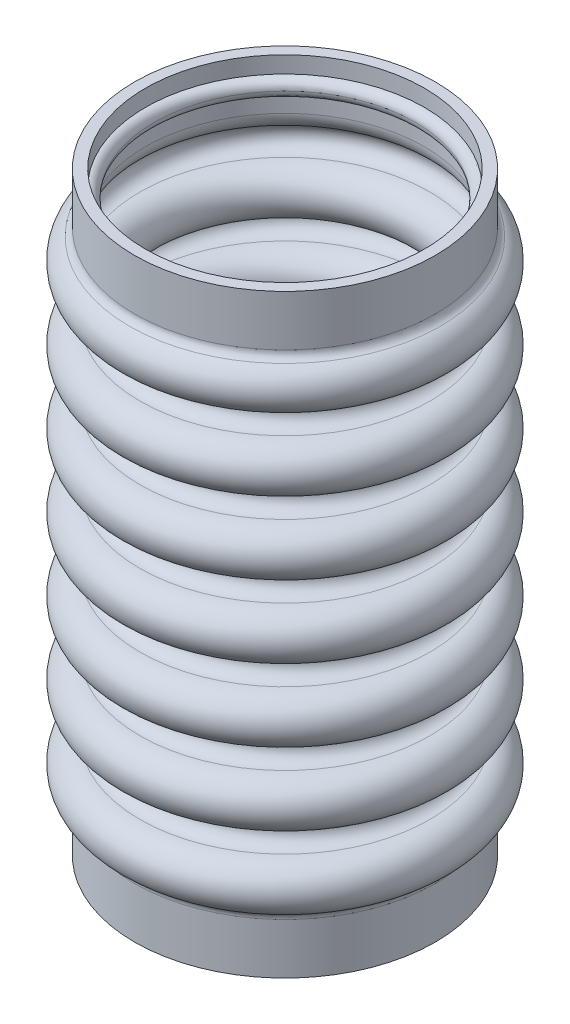
ISO-10303-21;
HEADER;
FILE_DESCRIPTION(('STEP AP214'),'2;1');
FILE_NAME('part.step','',(''),(''),'','','');
FILE_SCHEMA(('AUTOMOTIVE_DESIGN { 1 0 10303 214 1 1 1 1 }'));
ENDSEC;
DATA;
#1=APPLICATION_CONTEXT('core data for automotive mechanical design processes');
#2=APPLICATION_PROTOCOL_DEFINITION('international standard','automotive_design',2000,#1);
#3=PRODUCT_CONTEXT('',#1,'mechanical');
#4=PRODUCT('Part','Part','',(#3));
#5=PRODUCT_RELATED_PRODUCT_CATEGORY('part','',(#4));
#6=PRODUCT_DEFINITION_FORMATION('','',#4);
#7=PRODUCT_DEFINITION_CONTEXT('part definition',#1,'design');
#8=PRODUCT_DEFINITION('design','',#6,#7);
#9=PRODUCT_DEFINITION_SHAPE('','',#8);
#10=(LENGTH_UNIT() NAMED_UNIT(*) SI_UNIT(.MILLI.,.METRE.));
#11=(NAMED_UNIT(*) PLANE_ANGLE_UNIT() SI_UNIT($,.RADIAN.));
#12=(NAMED_UNIT(*) SI_UNIT($,.STERADIAN.) SOLID_ANGLE_UNIT());
#13=UNCERTAINTY_MEASURE_WITH_UNIT(LENGTH_MEASURE(1.E-05),#10,'distance_accuracy_value','');
#14=(GEOMETRIC_REPRESENTATION_CONTEXT(3) GLOBAL_UNCERTAINTY_ASSIGNED_CONTEXT((#13)) GLOBAL_UNIT_ASSIGNED_CONTEXT((#10,
#11,#12)) REPRESENTATION_CONTEXT('',''));
#15=CARTESIAN_POINT('',(0.,0.,0.));
#16=DIRECTION('',(0.,0.,1.));
#17=DIRECTION('',(1.,0.,0.));
#18=AXIS2_PLACEMENT_3D('',#15,#16,#17);
#19=CARTESIAN_POINT('',(0.,81.8309598041131,0.));
#20=DIRECTION('',(0.,1.,0.));
#21=DIRECTION('',(0.,0.,1.));
#22=AXIS2_PLACEMENT_3D('',#19,#20,#21);
#23=CYLINDRICAL_SURFACE('',#22,19.25);
#24=CARTESIAN_POINT('',(0.,8.46658803335676,0.));
#25=DIRECTION('',(0.,1.,0.));
#26=DIRECTION('',(0.,0.,1.));
#27=AXIS2_PLACEMENT_3D('',#24,#25,#26);
#28=CIRCLE('',#27,19.25);
#29=CARTESIAN_POINT('',(0.,8.46658803335676,19.25));
#30=VERTEX_POINT('',#29);
#31=EDGE_CURVE('E104',#30,#30,#28,.T.);
#32=ORIENTED_EDGE('',*,*,#31,.T.);
#33=EDGE_LOOP('',(#32));
#34=FACE_BOUND('',#33,.T.);
#35=CARTESIAN_POINT('',(0.,6.16658803335676,0.));
#36=DIRECTION('',(0.,1.,0.));
#37=DIRECTION('',(0.,0.,1.));
#38=AXIS2_PLACEMENT_3D('',#35,#36,#37);
#39=CIRCLE('',#38,19.25);
#40=CARTESIAN_POINT('',(0.,6.16658803335676,19.25));
#41=VERTEX_POINT('',#40);
#42=EDGE_CURVE('E52',#41,#41,#39,.T.);
#43=ORIENTED_EDGE('',*,*,#42,.F.);
#44=EDGE_LOOP('',(#43));
#45=FACE_BOUND('',#44,.T.);
#46=ADVANCED_FACE('F34',(#34,#45),#23,.F.);
#47=CARTESIAN_POINT('',(0.,81.8309598041131,0.));
#48=DIRECTION('',(0.,1.,0.));
#49=DIRECTION('',(0.,0.,1.));
#50=AXIS2_PLACEMENT_3D('',#47,#48,#49);
#51=CYLINDRICAL_SURFACE('',#50,19.25);
#52=CARTESIAN_POINT('',(0.,76.5348805808426,0.));
#53=DIRECTION('',(0.,1.,0.));
#54=DIRECTION('',(0.,0.,1.));
#55=AXIS2_PLACEMENT_3D('',#52,#53,#54);
#56=CIRCLE('',#55,19.25);
#57=CARTESIAN_POINT('',(0.,76.5348805808426,19.25));
#58=VERTEX_POINT('',#57);
#59=EDGE_CURVE('E59',#58,#58,#56,.T.);
#60=ORIENTED_EDGE('',*,*,#59,.F.);
#61=EDGE_LOOP('',(#60));
#62=FACE_BOUND('',#61,.T.);
#63=CARTESIAN_POINT('',(0.,78.8348805808426,0.));
#64=DIRECTION('',(0.,1.,0.));
#65=DIRECTION('',(0.,0.,1.));
#66=AXIS2_PLACEMENT_3D('',#63,#64,#65);
#67=CIRCLE('',#66,19.25);
#68=CARTESIAN_POINT('',(0.,78.8348805808426,19.25));
#69=VERTEX_POINT('',#68);
#70=EDGE_CURVE('E51',#69,#69,#67,.T.);
#71=ORIENTED_EDGE('',*,*,#70,.T.);
#72=EDGE_LOOP('',(#71));
#73=FACE_BOUND('',#72,.T.);
#74=ADVANCED_FACE('F181',(#62,#73),#51,.F.);
#75=CARTESIAN_POINT('',(0.,81.2348805808426,0.));
#76=DIRECTION('',(0.,1.,0.));
#77=DIRECTION('',(0.,0.,1.));
#78=AXIS2_PLACEMENT_3D('',#75,#76,#77);
#79=CIRCLE('',#78,19.25);
#80=CARTESIAN_POINT('',(0.,81.2348805808426,19.25));
#81=VERTEX_POINT('',#80);
#82=EDGE_CURVE('E42',#81,#81,#79,.T.);
#83=ORIENTED_EDGE('',*,*,#82,.F.);
#84=EDGE_LOOP('',(#83));
#85=FACE_BOUND('',#84,.T.);
#86=CARTESIAN_POINT('',(0.,83.5348805808426,0.));
#87=DIRECTION('',(0.,-1.,0.));
#88=DIRECTION('',(0.,0.,-1.));
#89=AXIS2_PLACEMENT_3D('',#86,#87,#88);
#90=CIRCLE('',#89,19.25);
#91=CARTESIAN_POINT('',(0.,83.5348805808426,-19.25));
#92=VERTEX_POINT('',#91);
#93=EDGE_CURVE('E158',#92,#92,#90,.T.);
#94=ORIENTED_EDGE('',*,*,#93,.F.);
#95=EDGE_LOOP('',(#94));
#96=FACE_BOUND('',#95,.T.);
#97=ADVANCED_FACE('F188',(#85,#96),#51,.F.);
#98=CARTESIAN_POINT('',(0.,76.5348805808426,0.));
#99=DIRECTION('',(0.,1.,0.));
#100=DIRECTION('',(0.,0.,1.));
#101=AXIS2_PLACEMENT_3D('',#98,#99,#100);
#102=TOROIDAL_SURFACE('',#101,22.,2.75);
#103=ORIENTED_EDGE('',*,*,#59,.T.);
#104=EDGE_LOOP('',(#103));
#105=FACE_BOUND('',#104,.T.);
#106=CARTESIAN_POINT('',(0.,74.0691268389424,0.));
#107=DIRECTION('',(0.,1.,0.));
#108=DIRECTION('',(0.,0.,1.));
#109=AXIS2_PLACEMENT_3D('',#106,#107,#108);
#110=CIRCLE('',#109,20.7823964174226);
#111=CARTESIAN_POINT('',(0.,74.0691268389424,20.7823964174226));
#112=VERTEX_POINT('',#111);
#113=EDGE_CURVE('E62',#112,#112,#110,.T.);
#114=ORIENTED_EDGE('',*,*,#113,.F.);
#115=EDGE_LOOP('',(#114));
#116=FACE_BOUND('',#115,.T.);
#117=ADVANCED_FACE('F326',(#105,#116),#102,.T.);
#118=CARTESIAN_POINT('',(0.,72.5000056653708,0.));
#119=DIRECTION('',(0.,1.,0.));
#120=DIRECTION('',(0.,0.,1.));
#121=AXIS2_PLACEMENT_3D('',#118,#119,#120);
#122=TOROIDAL_SURFACE('',#121,20.007555227902,1.75000575037007);
#123=ORIENTED_EDGE('',*,*,#113,.T.);
#124=EDGE_LOOP('',(#123));
#125=FACE_BOUND('',#124,.T.);
#126=CARTESIAN_POINT('',(0.,70.7500013204338,0.));
#127=DIRECTION('',(0.,1.,0.));
#128=DIRECTION('',(0.,0.,1.));
#129=AXIS2_PLACEMENT_3D('',#126,#127,#128);
#130=CIRCLE('',#129,20.0053373392861);
#131=CARTESIAN_POINT('',(0.,70.7500013204338,20.0053373392861));
#132=VERTEX_POINT('',#131);
#133=EDGE_CURVE('E65',#132,#132,#130,.T.);
#134=ORIENTED_EDGE('',*,*,#133,.F.);
#135=EDGE_LOOP('',(#134));
#136=FACE_BOUND('',#135,.T.);
#137=ADVANCED_FACE('F330',(#125,#136),#122,.F.);
#138=CARTESIAN_POINT('',(0.,67.5000039275327,0.));
#139=DIRECTION('',(0.,1.,0.));
#140=DIRECTION('',(0.,0.,1.));
#141=AXIS2_PLACEMENT_3D('',#138,#139,#140);
#142=TOROIDAL_SURFACE('',#141,20.0012184168156,3.25000000298248);
#143=ORIENTED_EDGE('',*,*,#133,.T.);
#144=EDGE_LOOP('',(#143));
#145=FACE_BOUND('',#144,.T.);
#146=CARTESIAN_POINT('',(0.,64.2500027376119,0.));
#147=DIRECTION('',(0.,1.,0.));
#148=DIRECTION('',(0.,0.,1.));
#149=AXIS2_PLACEMENT_3D('',#146,#147,#148);
#150=CIRCLE('',#149,20.0034163015585);
#151=CARTESIAN_POINT('',(0.,64.2500027376119,20.0034163015585));
#152=VERTEX_POINT('',#151);
#153=EDGE_CURVE('E68',#152,#152,#150,.T.);
#154=ORIENTED_EDGE('',*,*,#153,.F.);
#155=EDGE_LOOP('',(#154));
#156=FACE_BOUND('',#155,.T.);
#157=ADVANCED_FACE('F334',(#145,#156),#142,.T.);
#158=CARTESIAN_POINT('',(0.,62.5000008894755,0.));
#159=DIRECTION('',(0.,1.,0.));
#160=DIRECTION('',(0.,0.,1.));
#161=AXIS2_PLACEMENT_3D('',#158,#159,#160);
#162=TOROIDAL_SURFACE('',#161,20.004599778775,1.75000224831263);
#163=ORIENTED_EDGE('',*,*,#153,.T.);
#164=EDGE_LOOP('',(#163));
#165=FACE_BOUND('',#164,.T.);
#166=CARTESIAN_POINT('',(0.,60.750000711924,0.));
#167=DIRECTION('',(0.,1.,0.));
#168=DIRECTION('',(0.,0.,1.));
#169=AXIS2_PLACEMENT_3D('',#166,#167,#168);
#170=CIRCLE('',#169,20.0048940231412);
#171=CARTESIAN_POINT('',(0.,60.750000711924,20.0048940231412));
#172=VERTEX_POINT('',#171);
#173=EDGE_CURVE('E71',#172,#172,#170,.T.);
#174=ORIENTED_EDGE('',*,*,#173,.F.);
#175=EDGE_LOOP('',(#174));
#176=FACE_BOUND('',#175,.T.);
#177=ADVANCED_FACE('F338',(#165,#176),#162,.F.);
#178=CARTESIAN_POINT('',(0.,57.5000029033183,0.));
#179=DIRECTION('',(0.,1.,0.));
#180=DIRECTION('',(0.,0.,1.));
#181=AXIS2_PLACEMENT_3D('',#178,#179,#180);
#182=TOROIDAL_SURFACE('',#181,20.0012184168156,3.24999988708052);
#183=ORIENTED_EDGE('',*,*,#173,.T.);
#184=EDGE_LOOP('',(#183));
#185=FACE_BOUND('',#184,.T.);
#186=CARTESIAN_POINT('',(0.,54.2500017133975,0.));
#187=DIRECTION('',(0.,1.,0.));
#188=DIRECTION('',(0.,0.,1.));
#189=AXIS2_PLACEMENT_3D('',#186,#187,#188);
#190=CIRCLE('',#189,20.0034163015584);
#191=CARTESIAN_POINT('',(0.,54.2500017133975,20.0034163015584));
#192=VERTEX_POINT('',#191);
#193=EDGE_CURVE('E74',#192,#192,#190,.T.);
#194=ORIENTED_EDGE('',*,*,#193,.F.);
#195=EDGE_LOOP('',(#194));
#196=FACE_BOUND('',#195,.T.);
#197=ADVANCED_FACE('F342',(#185,#196),#182,.T.);
#198=CARTESIAN_POINT('',(0.,52.4999998652611,0.));
#199=DIRECTION('',(0.,1.,0.));
#200=DIRECTION('',(0.,0.,1.));
#201=AXIS2_PLACEMENT_3D('',#198,#199,#200);
#202=TOROIDAL_SURFACE('',#201,20.004599778775,1.75000224831263);
#203=ORIENTED_EDGE('',*,*,#193,.T.);
#204=EDGE_LOOP('',(#203));
#205=FACE_BOUND('',#204,.T.);
#206=CARTESIAN_POINT('',(0.,50.7499996877096,0.));
#207=DIRECTION('',(0.,1.,0.));
#208=DIRECTION('',(0.,0.,1.));
#209=AXIS2_PLACEMENT_3D('',#206,#207,#208);
#210=CIRCLE('',#209,20.0048940231412);
#211=CARTESIAN_POINT('',(0.,50.7499996877096,20.0048940231412));
#212=VERTEX_POINT('',#211);
#213=EDGE_CURVE('E77',#212,#212,#210,.T.);
#214=ORIENTED_EDGE('',*,*,#213,.F.);
#215=EDGE_LOOP('',(#214));
#216=FACE_BOUND('',#215,.T.);
#217=ADVANCED_FACE('F346',(#205,#216),#202,.F.);
#218=CARTESIAN_POINT('',(0.,47.5000018791039,0.));
#219=DIRECTION('',(0.,1.,0.));
#220=DIRECTION('',(0.,0.,1.));
#221=AXIS2_PLACEMENT_3D('',#218,#219,#220);
#222=TOROIDAL_SURFACE('',#221,20.0012184168156,3.24999988708052);
#223=ORIENTED_EDGE('',*,*,#213,.T.);
#224=EDGE_LOOP('',(#223));
#225=FACE_BOUND('',#224,.T.);
#226=CARTESIAN_POINT('',(0.,44.2500006891831,0.));
#227=DIRECTION('',(0.,1.,0.));
#228=DIRECTION('',(0.,0.,1.));
#229=AXIS2_PLACEMENT_3D('',#226,#227,#228);
#230=CIRCLE('',#229,20.0034163015584);
#231=CARTESIAN_POINT('',(0.,44.2500006891831,20.0034163015584));
#232=VERTEX_POINT('',#231);
#233=EDGE_CURVE('E80',#232,#232,#230,.T.);
#234=ORIENTED_EDGE('',*,*,#233,.F.);
#235=EDGE_LOOP('',(#234));
#236=FACE_BOUND('',#235,.T.);
#237=ADVANCED_FACE('F350',(#225,#236),#222,.T.);
#238=CARTESIAN_POINT('',(0.,42.4999988410467,0.));
#239=DIRECTION('',(0.,1.,0.));
#240=DIRECTION('',(0.,0.,1.));
#241=AXIS2_PLACEMENT_3D('',#238,#239,#240);
#242=TOROIDAL_SURFACE('',#241,20.0045997787749,1.75000224831263);
#243=ORIENTED_EDGE('',*,*,#233,.T.);
#244=EDGE_LOOP('',(#243));
#245=FACE_BOUND('',#244,.T.);
#246=CARTESIAN_POINT('',(0.,40.7499986634952,0.));
#247=DIRECTION('',(0.,1.,0.));
#248=DIRECTION('',(0.,0.,1.));
#249=AXIS2_PLACEMENT_3D('',#246,#247,#248);
#250=CIRCLE('',#249,20.0048940231412);
#251=CARTESIAN_POINT('',(0.,40.7499986634952,20.0048940231412));
#252=VERTEX_POINT('',#251);
#253=EDGE_CURVE('E83',#252,#252,#250,.T.);
#254=ORIENTED_EDGE('',*,*,#253,.F.);
#255=EDGE_LOOP('',(#254));
#256=FACE_BOUND('',#255,.T.);
#257=ADVANCED_FACE('F354',(#245,#256),#242,.F.);
#258=CARTESIAN_POINT('',(0.,37.5000008548895,0.));
#259=DIRECTION('',(0.,1.,0.));
#260=DIRECTION('',(0.,0.,1.));
#261=AXIS2_PLACEMENT_3D('',#258,#259,#260);
#262=TOROIDAL_SURFACE('',#261,20.0012184168155,3.24999988708052);
#263=ORIENTED_EDGE('',*,*,#253,.T.);
#264=EDGE_LOOP('',(#263));
#265=FACE_BOUND('',#264,.T.);
#266=CARTESIAN_POINT('',(0.,34.2499996649687,0.));
#267=DIRECTION('',(0.,1.,0.));
#268=DIRECTION('',(0.,0.,1.));
#269=AXIS2_PLACEMENT_3D('',#266,#267,#268);
#270=CIRCLE('',#269,20.0034163015584);
#271=CARTESIAN_POINT('',(0.,34.2499996649687,20.0034163015584));
#272=VERTEX_POINT('',#271);
#273=EDGE_CURVE('E86',#272,#272,#270,.T.);
#274=ORIENTED_EDGE('',*,*,#273,.F.);
#275=EDGE_LOOP('',(#274));
#276=FACE_BOUND('',#275,.T.);
#277=ADVANCED_FACE('F358',(#265,#276),#262,.T.);
#278=CARTESIAN_POINT('',(0.,32.4999978168323,0.));
#279=DIRECTION('',(0.,1.,0.));
#280=DIRECTION('',(0.,0.,1.));
#281=AXIS2_PLACEMENT_3D('',#278,#279,#280);
#282=TOROIDAL_SURFACE('',#281,20.0045997787749,1.75000224831263);
#283=ORIENTED_EDGE('',*,*,#273,.T.);
#284=EDGE_LOOP('',(#283));
#285=FACE_BOUND('',#284,.T.);
#286=CARTESIAN_POINT('',(0.,30.7499976392808,0.));
#287=DIRECTION('',(0.,1.,0.));
#288=DIRECTION('',(0.,0.,1.));
#289=AXIS2_PLACEMENT_3D('',#286,#287,#288);
#290=CIRCLE('',#289,20.0048940231411);
#291=CARTESIAN_POINT('',(0.,30.7499976392808,20.0048940231411));
#292=VERTEX_POINT('',#291);
#293=EDGE_CURVE('E89',#292,#292,#290,.T.);
#294=ORIENTED_EDGE('',*,*,#293,.F.);
#295=EDGE_LOOP('',(#294));
#296=FACE_BOUND('',#295,.T.);
#297=ADVANCED_FACE('F362',(#285,#296),#282,.F.);
#298=CARTESIAN_POINT('',(0.,27.4999998306751,0.));
#299=DIRECTION('',(0.,1.,0.));
#300=DIRECTION('',(0.,0.,1.));
#301=AXIS2_PLACEMENT_3D('',#298,#299,#300);
#302=TOROIDAL_SURFACE('',#301,20.0012184168155,3.24999988708052);
#303=ORIENTED_EDGE('',*,*,#293,.T.);
#304=EDGE_LOOP('',(#303));
#305=FACE_BOUND('',#304,.T.);
#306=CARTESIAN_POINT('',(0.,24.2499986407543,0.));
#307=DIRECTION('',(0.,1.,0.));
#308=DIRECTION('',(0.,0.,1.));
#309=AXIS2_PLACEMENT_3D('',#306,#307,#308);
#310=CIRCLE('',#309,20.0034163015583);
#311=CARTESIAN_POINT('',(0.,24.2499986407543,20.0034163015583));
#312=VERTEX_POINT('',#311);
#313=EDGE_CURVE('E92',#312,#312,#310,.T.);
#314=ORIENTED_EDGE('',*,*,#313,.F.);
#315=EDGE_LOOP('',(#314));
#316=FACE_BOUND('',#315,.T.);
#317=ADVANCED_FACE('F366',(#305,#316),#302,.T.);
#318=CARTESIAN_POINT('',(0.,22.4999967926179,0.));
#319=DIRECTION('',(0.,1.,0.));
#320=DIRECTION('',(0.,0.,1.));
#321=AXIS2_PLACEMENT_3D('',#318,#319,#320);
#322=TOROIDAL_SURFACE('',#321,20.0045997787749,1.75000224831263);
#323=ORIENTED_EDGE('',*,*,#313,.T.);
#324=EDGE_LOOP('',(#323));
#325=FACE_BOUND('',#324,.T.);
#326=CARTESIAN_POINT('',(0.,20.7499966150664,0.));
#327=DIRECTION('',(0.,1.,0.));
#328=DIRECTION('',(0.,0.,1.));
#329=AXIS2_PLACEMENT_3D('',#326,#327,#328);
#330=CIRCLE('',#329,20.0048940231411);
#331=CARTESIAN_POINT('',(0.,20.7499966150664,20.0048940231411));
#332=VERTEX_POINT('',#331);
#333=EDGE_CURVE('E95',#332,#332,#330,.T.);
#334=ORIENTED_EDGE('',*,*,#333,.F.);
#335=EDGE_LOOP('',(#334));
#336=FACE_BOUND('',#335,.T.);
#337=ADVANCED_FACE('F370',(#325,#336),#322,.F.);
#338=CARTESIAN_POINT('',(0.,17.4999988064607,0.));
#339=DIRECTION('',(0.,1.,0.));
#340=DIRECTION('',(0.,0.,1.));
#341=AXIS2_PLACEMENT_3D('',#338,#339,#340);
#342=TOROIDAL_SURFACE('',#341,20.0012184168155,3.24999988708052);
#343=ORIENTED_EDGE('',*,*,#333,.T.);
#344=EDGE_LOOP('',(#343));
#345=FACE_BOUND('',#344,.T.);
#346=CARTESIAN_POINT('',(0.,14.2499974574447,0.));
#347=DIRECTION('',(0.,1.,0.));
#348=DIRECTION('',(0.,0.,1.));
#349=AXIS2_PLACEMENT_3D('',#346,#347,#348);
#350=CIRCLE('',#349,20.0034163016659);
#351=CARTESIAN_POINT('',(0.,14.2499974574447,20.0034163016659));
#352=VERTEX_POINT('',#351);
#353=EDGE_CURVE('E98',#352,#352,#350,.T.);
#354=ORIENTED_EDGE('',*,*,#353,.F.);
#355=EDGE_LOOP('',(#354));
#356=FACE_BOUND('',#355,.T.);
#357=ADVANCED_FACE('F374',(#345,#356),#342,.T.);
#358=CARTESIAN_POINT('',(0.,12.4999957684035,0.));
#359=DIRECTION('',(0.,1.,0.));
#360=DIRECTION('',(0.,0.,1.));
#361=AXIS2_PLACEMENT_3D('',#358,#359,#360);
#362=TOROIDAL_SURFACE('',#361,20.0045997787748,1.75000208921741);
#363=ORIENTED_EDGE('',*,*,#353,.T.);
#364=EDGE_LOOP('',(#363));
#365=FACE_BOUND('',#364,.T.);
#366=CARTESIAN_POINT('',(0.,10.9314483158853,0.));
#367=DIRECTION('',(0.,1.,0.));
#368=DIRECTION('',(0.,0.,1.));
#369=AXIS2_PLACEMENT_3D('',#366,#367,#368);
#370=CIRCLE('',#369,20.7805887536957);
#371=CARTESIAN_POINT('',(0.,10.9314483158853,20.7805887536957));
#372=VERTEX_POINT('',#371);
#373=EDGE_CURVE('E101',#372,#372,#370,.T.);
#374=ORIENTED_EDGE('',*,*,#373,.F.);
#375=EDGE_LOOP('',(#374));
#376=FACE_BOUND('',#375,.T.);
#377=ADVANCED_FACE('F205',(#365,#376),#362,.F.);
#378=CARTESIAN_POINT('',(0.,8.46658803335676,0.));
#379=DIRECTION('',(0.,1.,0.));
#380=DIRECTION('',(0.,0.,1.));
#381=AXIS2_PLACEMENT_3D('',#378,#379,#380);
#382=TOROIDAL_SURFACE('',#381,22.,2.75);
#383=ORIENTED_EDGE('',*,*,#373,.T.);
#384=EDGE_LOOP('',(#383));
#385=FACE_BOUND('',#384,.T.);
#386=ORIENTED_EDGE('',*,*,#31,.F.);
#387=EDGE_LOOP('',(#386));
#388=FACE_BOUND('',#387,.T.);
#389=ADVANCED_FACE('F196',(#385,#388),#382,.T.);
#390=CARTESIAN_POINT('',(0.,3.76658803335675,0.));
#391=DIRECTION('',(0.,-1.,0.));
#392=DIRECTION('',(0.,0.,-1.));
#393=AXIS2_PLACEMENT_3D('',#390,#391,#392);
#394=CIRCLE('',#393,19.25);
#395=CARTESIAN_POINT('',(0.,3.76658803335675,-19.25));
#396=VERTEX_POINT('',#395);
#397=EDGE_CURVE('E10',#396,#396,#394,.T.);
#398=ORIENTED_EDGE('',*,*,#397,.F.);
#399=EDGE_LOOP('',(#398));
#400=FACE_BOUND('',#399,.T.);
#401=CARTESIAN_POINT('',(0.,1.46658803335675,0.));
#402=DIRECTION('',(0.,1.,0.));
#403=DIRECTION('',(0.,0.,1.));
#404=AXIS2_PLACEMENT_3D('',#401,#402,#403);
#405=CIRCLE('',#404,19.25);
#406=CARTESIAN_POINT('',(0.,1.46658803335675,19.25));
#407=VERTEX_POINT('',#406);
#408=EDGE_CURVE('E155',#407,#407,#405,.T.);
#409=ORIENTED_EDGE('',*,*,#408,.F.);
#410=EDGE_LOOP('',(#409));
#411=FACE_BOUND('',#410,.T.);
#412=ADVANCED_FACE('F184',(#400,#411),#23,.F.);
#413=CARTESIAN_POINT('',(-23.2575609782721,83.5348805808426,20.75));
#414=DIRECTION('',(0.,-1.,0.));
#415=DIRECTION('',(0.,0.,-1.));
#416=AXIS2_PLACEMENT_3D('',#413,#414,#415);
#417=PLANE('',#416);
#418=ORIENTED_EDGE('',*,*,#93,.T.);
#419=EDGE_LOOP('',(#418));
#420=FACE_BOUND('',#419,.T.);
#421=CARTESIAN_POINT('',(0.,83.5348805808426,0.));
#422=DIRECTION('',(0.,-1.,0.));
#423=DIRECTION('',(0.,0.,-1.));
#424=AXIS2_PLACEMENT_3D('',#421,#422,#423);
#425=CIRCLE('',#424,20.75);
#426=CARTESIAN_POINT('',(0.,83.5348805808426,-20.75));
#427=VERTEX_POINT('',#426);
#428=EDGE_CURVE('E56',#427,#427,#425,.F.);
#429=ORIENTED_EDGE('',*,*,#428,.T.);
#430=EDGE_LOOP('',(#429));
#431=FACE_BOUND('',#430,.T.);
#432=ADVANCED_FACE('F195',(#420,#431),#417,.F.);
#433=CARTESIAN_POINT('',(-23.2575609782721,1.46658803335676,20.75));
#434=DIRECTION('',(0.,1.,0.));
#435=DIRECTION('',(0.,0.,1.));
#436=AXIS2_PLACEMENT_3D('',#433,#434,#435);
#437=PLANE('',#436);
#438=ORIENTED_EDGE('',*,*,#408,.T.);
#439=EDGE_LOOP('',(#438));
#440=FACE_BOUND('',#439,.T.);
#441=CARTESIAN_POINT('',(0.,1.46658803335675,0.));
#442=DIRECTION('',(0.,1.,0.));
#443=DIRECTION('',(0.,0.,1.));
#444=AXIS2_PLACEMENT_3D('',#441,#442,#443);
#445=CIRCLE('',#444,20.75);
#446=CARTESIAN_POINT('',(0.,1.46658803335675,20.75));
#447=VERTEX_POINT('',#446);
#448=EDGE_CURVE('E46',#447,#447,#445,.F.);
#449=ORIENTED_EDGE('',*,*,#448,.T.);
#450=EDGE_LOOP('',(#449));
#451=FACE_BOUND('',#450,.T.);
#452=ADVANCED_FACE('F202',(#440,#451),#437,.F.);
#453=CARTESIAN_POINT('',(0.,37.5000008548895,0.));
#454=DIRECTION('',(0.,1.,0.));
#455=DIRECTION('',(0.,0.,1.));
#456=AXIS2_PLACEMENT_3D('',#453,#454,#455);
#457=TOROIDAL_SURFACE('',#456,20.0012184168155,1.7500001620777);
#458=CARTESIAN_POINT('',(0.,35.7500010929875,0.));
#459=DIRECTION('',(0.,1.,0.));
#460=DIRECTION('',(0.,0.,1.));
#461=AXIS2_PLACEMENT_3D('',#458,#459,#460);
#462=CIRCLE('',#461,20.0024018926212);
#463=CARTESIAN_POINT('',(0.,35.7500010929875,20.0024018926212));
#464=VERTEX_POINT('',#463);
#465=EDGE_CURVE('E125',#464,#464,#462,.T.);
#466=ORIENTED_EDGE('',*,*,#465,.T.);
#467=EDGE_LOOP('',(#466));
#468=FACE_BOUND('',#467,.T.);
#469=CARTESIAN_POINT('',(0.,39.2499969475216,0.));
#470=DIRECTION('',(0.,1.,0.));
#471=DIRECTION('',(0.,0.,1.));
#472=AXIS2_PLACEMENT_3D('',#469,#470,#471);
#473=CIRCLE('',#472,20.0038796139348);
#474=CARTESIAN_POINT('',(0.,39.2499969475216,20.0038796139348));
#475=VERTEX_POINT('',#474);
#476=EDGE_CURVE('E128',#475,#475,#473,.T.);
#477=ORIENTED_EDGE('',*,*,#476,.F.);
#478=EDGE_LOOP('',(#477));
#479=FACE_BOUND('',#478,.T.);
#480=ADVANCED_FACE('F212',(#468,#479),#457,.F.);
#481=CARTESIAN_POINT('',(0.,32.4999978168323,0.));
#482=DIRECTION('',(0.,1.,0.));
#483=DIRECTION('',(0.,0.,1.));
#484=AXIS2_PLACEMENT_3D('',#481,#482,#483);
#485=TOROIDAL_SURFACE('',#484,20.0045997787749,3.25000197331544);
#486=CARTESIAN_POINT('',(0.,29.2499959233072,0.));
#487=DIRECTION('',(0.,1.,0.));
#488=DIRECTION('',(0.,0.,1.));
#489=AXIS2_PLACEMENT_3D('',#486,#487,#488);
#490=CIRCLE('',#489,20.0038796139347);
#491=CARTESIAN_POINT('',(0.,29.2499959233072,20.0038796139347));
#492=VERTEX_POINT('',#491);
#493=EDGE_CURVE('E122',#492,#492,#490,.T.);
#494=ORIENTED_EDGE('',*,*,#493,.T.);
#495=EDGE_LOOP('',(#494));
#496=FACE_BOUND('',#495,.T.);
#497=ORIENTED_EDGE('',*,*,#465,.F.);
#498=EDGE_LOOP('',(#497));
#499=FACE_BOUND('',#498,.T.);
#500=ADVANCED_FACE('F249',(#496,#499),#485,.T.);
#501=CARTESIAN_POINT('',(0.,27.4999998306751,0.));
#502=DIRECTION('',(0.,1.,0.));
#503=DIRECTION('',(0.,0.,1.));
#504=AXIS2_PLACEMENT_3D('',#501,#502,#503);
#505=TOROIDAL_SURFACE('',#504,20.0012184168155,1.7500001620777);
#506=CARTESIAN_POINT('',(0.,25.7500000687731,0.));
#507=DIRECTION('',(0.,1.,0.));
#508=DIRECTION('',(0.,0.,1.));
#509=AXIS2_PLACEMENT_3D('',#506,#507,#508);
#510=CIRCLE('',#509,20.0024018926212);
#511=CARTESIAN_POINT('',(0.,25.7500000687731,20.0024018926212));
#512=VERTEX_POINT('',#511);
#513=EDGE_CURVE('E119',#512,#512,#510,.T.);
#514=ORIENTED_EDGE('',*,*,#513,.T.);
#515=EDGE_LOOP('',(#514));
#516=FACE_BOUND('',#515,.T.);
#517=ORIENTED_EDGE('',*,*,#493,.F.);
#518=EDGE_LOOP('',(#517));
#519=FACE_BOUND('',#518,.T.);
#520=ADVANCED_FACE('F243',(#516,#519),#505,.F.);
#521=CARTESIAN_POINT('',(0.,22.4999967926179,0.));
#522=DIRECTION('',(0.,1.,0.));
#523=DIRECTION('',(0.,0.,1.));
#524=AXIS2_PLACEMENT_3D('',#521,#522,#523);
#525=TOROIDAL_SURFACE('',#524,20.0045997787749,3.25000197331544);
#526=CARTESIAN_POINT('',(0.,19.2499948990928,0.));
#527=DIRECTION('',(0.,1.,0.));
#528=DIRECTION('',(0.,0.,1.));
#529=AXIS2_PLACEMENT_3D('',#526,#527,#528);
#530=CIRCLE('',#529,20.0038796139347);
#531=CARTESIAN_POINT('',(0.,19.2499948990928,20.0038796139347));
#532=VERTEX_POINT('',#531);
#533=EDGE_CURVE('E116',#532,#532,#530,.T.);
#534=ORIENTED_EDGE('',*,*,#533,.T.);
#535=EDGE_LOOP('',(#534));
#536=FACE_BOUND('',#535,.T.);
#537=ORIENTED_EDGE('',*,*,#513,.F.);
#538=EDGE_LOOP('',(#537));
#539=FACE_BOUND('',#538,.T.);
#540=ADVANCED_FACE('F237',(#536,#539),#525,.T.);
#541=CARTESIAN_POINT('',(0.,17.4999988064607,0.));
#542=DIRECTION('',(0.,1.,0.));
#543=DIRECTION('',(0.,0.,1.));
#544=AXIS2_PLACEMENT_3D('',#541,#542,#543);
#545=TOROIDAL_SURFACE('',#544,20.0012184168155,1.7500001620777);
#546=CARTESIAN_POINT('',(0.,15.7499990445587,0.));
#547=DIRECTION('',(0.,1.,0.));
#548=DIRECTION('',(0.,0.,1.));
#549=AXIS2_PLACEMENT_3D('',#546,#547,#548);
#550=CIRCLE('',#549,20.0024018926211);
#551=CARTESIAN_POINT('',(0.,15.7499990445587,20.0024018926211));
#552=VERTEX_POINT('',#551);
#553=EDGE_CURVE('E113',#552,#552,#550,.T.);
#554=ORIENTED_EDGE('',*,*,#553,.T.);
#555=EDGE_LOOP('',(#554));
#556=FACE_BOUND('',#555,.T.);
#557=ORIENTED_EDGE('',*,*,#533,.F.);
#558=EDGE_LOOP('',(#557));
#559=FACE_BOUND('',#558,.T.);
#560=ADVANCED_FACE('F231',(#556,#559),#545,.F.);
#561=CARTESIAN_POINT('',(0.,12.4999957684035,0.));
#562=DIRECTION('',(0.,1.,0.));
#563=DIRECTION('',(0.,0.,1.));
#564=AXIS2_PLACEMENT_3D('',#561,#562,#563);
#565=TOROIDAL_SURFACE('',#564,20.0045997787748,3.25000208921741);
#566=CARTESIAN_POINT('',(0.,9.58697719827736,0.));
#567=DIRECTION('',(0.,1.,0.));
#568=DIRECTION('',(0.,0.,1.));
#569=AXIS2_PLACEMENT_3D('',#566,#567,#568);
#570=CIRCLE('',#569,21.4457230871763);
#571=CARTESIAN_POINT('',(0.,9.58697719827736,21.4457230871763));
#572=VERTEX_POINT('',#571);
#573=EDGE_CURVE('E110',#572,#572,#570,.T.);
#574=ORIENTED_EDGE('',*,*,#573,.T.);
#575=EDGE_LOOP('',(#574));
#576=FACE_BOUND('',#575,.T.);
#577=ORIENTED_EDGE('',*,*,#553,.F.);
#578=EDGE_LOOP('',(#577));
#579=FACE_BOUND('',#578,.T.);
#580=ADVANCED_FACE('F225',(#576,#579),#565,.T.);
#581=CARTESIAN_POINT('',(0.,8.46658803335676,0.));
#582=DIRECTION('',(0.,1.,0.));
#583=DIRECTION('',(0.,0.,1.));
#584=AXIS2_PLACEMENT_3D('',#581,#582,#583);
#585=TOROIDAL_SURFACE('',#584,22.,1.25);
#586=CARTESIAN_POINT('',(0.,8.46658803335676,0.));
#587=DIRECTION('',(0.,1.,0.));
#588=DIRECTION('',(0.,0.,1.));
#589=AXIS2_PLACEMENT_3D('',#586,#587,#588);
#590=CIRCLE('',#589,20.75);
#591=CARTESIAN_POINT('',(0.,8.46658803335676,20.75));
#592=VERTEX_POINT('',#591);
#593=EDGE_CURVE('E107',#592,#592,#590,.T.);
#594=ORIENTED_EDGE('',*,*,#593,.T.);
#595=EDGE_LOOP('',(#594));
#596=FACE_BOUND('',#595,.T.);
#597=ORIENTED_EDGE('',*,*,#573,.F.);
#598=EDGE_LOOP('',(#597));
#599=FACE_BOUND('',#598,.T.);
#600=ADVANCED_FACE('F220',(#596,#599),#585,.F.);
#601=CARTESIAN_POINT('',(0.,81.8309598041131,0.));
#602=DIRECTION('',(0.,1.,0.));
#603=DIRECTION('',(0.,0.,1.));
#604=AXIS2_PLACEMENT_3D('',#601,#602,#603);
#605=CYLINDRICAL_SURFACE('',#604,20.75);
#606=ORIENTED_EDGE('',*,*,#448,.F.);
#607=EDGE_LOOP('',(#606));
#608=FACE_BOUND('',#607,.T.);
#609=ORIENTED_EDGE('',*,*,#593,.F.);
#610=EDGE_LOOP('',(#609));
#611=FACE_BOUND('',#610,.T.);
#612=ADVANCED_FACE('F216',(#608,#611),#605,.T.);
#613=CARTESIAN_POINT('',(0.,42.4999988410467,0.));
#614=DIRECTION('',(0.,1.,0.));
#615=DIRECTION('',(0.,0.,1.));
#616=AXIS2_PLACEMENT_3D('',#613,#614,#615);
#617=TOROIDAL_SURFACE('',#616,20.0045997787749,3.25000197331544);
#618=ORIENTED_EDGE('',*,*,#476,.T.);
#619=EDGE_LOOP('',(#618));
#620=FACE_BOUND('',#619,.T.);
#621=CARTESIAN_POINT('',(0.,45.7500021172019,0.));
#622=DIRECTION('',(0.,1.,0.));
#623=DIRECTION('',(0.,0.,1.));
#624=AXIS2_PLACEMENT_3D('',#621,#622,#623);
#625=CIRCLE('',#624,20.0024018926212);
#626=CARTESIAN_POINT('',(0.,45.7500021172019,20.0024018926212));
#627=VERTEX_POINT('',#626);
#628=EDGE_CURVE('E131',#627,#627,#625,.T.);
#629=ORIENTED_EDGE('',*,*,#628,.F.);
#630=EDGE_LOOP('',(#629));
#631=FACE_BOUND('',#630,.T.);
#632=ADVANCED_FACE('F219',(#620,#631),#617,.T.);
#633=CARTESIAN_POINT('',(0.,47.5000018791039,0.));
#634=DIRECTION('',(0.,1.,0.));
#635=DIRECTION('',(0.,0.,1.));
#636=AXIS2_PLACEMENT_3D('',#633,#634,#635);
#637=TOROIDAL_SURFACE('',#636,20.0012184168156,1.7500001620777);
#638=ORIENTED_EDGE('',*,*,#628,.T.);
#639=EDGE_LOOP('',(#638));
#640=FACE_BOUND('',#639,.T.);
#641=CARTESIAN_POINT('',(0.,49.249997971736,0.));
#642=DIRECTION('',(0.,1.,0.));
#643=DIRECTION('',(0.,0.,1.));
#644=AXIS2_PLACEMENT_3D('',#641,#642,#643);
#645=CIRCLE('',#644,20.0038796139348);
#646=CARTESIAN_POINT('',(0.,49.249997971736,20.0038796139348));
#647=VERTEX_POINT('',#646);
#648=EDGE_CURVE('E134',#647,#647,#645,.T.);
#649=ORIENTED_EDGE('',*,*,#648,.F.);
#650=EDGE_LOOP('',(#649));
#651=FACE_BOUND('',#650,.T.);
#652=ADVANCED_FACE('F265',(#640,#651),#637,.F.);
#653=CARTESIAN_POINT('',(0.,52.4999998652611,0.));
#654=DIRECTION('',(0.,1.,0.));
#655=DIRECTION('',(0.,0.,1.));
#656=AXIS2_PLACEMENT_3D('',#653,#654,#655);
#657=TOROIDAL_SURFACE('',#656,20.004599778775,3.25000197331544);
#658=ORIENTED_EDGE('',*,*,#648,.T.);
#659=EDGE_LOOP('',(#658));
#660=FACE_BOUND('',#659,.T.);
#661=CARTESIAN_POINT('',(0.,55.7500031414163,0.));
#662=DIRECTION('',(0.,1.,0.));
#663=DIRECTION('',(0.,0.,1.));
#664=AXIS2_PLACEMENT_3D('',#661,#662,#663);
#665=CIRCLE('',#664,20.0024018926213);
#666=CARTESIAN_POINT('',(0.,55.7500031414163,20.0024018926213));
#667=VERTEX_POINT('',#666);
#668=EDGE_CURVE('E137',#667,#667,#665,.T.);
#669=ORIENTED_EDGE('',*,*,#668,.F.);
#670=EDGE_LOOP('',(#669));
#671=FACE_BOUND('',#670,.T.);
#672=ADVANCED_FACE('F271',(#660,#671),#657,.T.);
#673=CARTESIAN_POINT('',(0.,57.5000029033183,0.));
#674=DIRECTION('',(0.,1.,0.));
#675=DIRECTION('',(0.,0.,1.));
#676=AXIS2_PLACEMENT_3D('',#673,#674,#675);
#677=TOROIDAL_SURFACE('',#676,20.0012184168156,1.7500001620777);
#678=ORIENTED_EDGE('',*,*,#668,.T.);
#679=EDGE_LOOP('',(#678));
#680=FACE_BOUND('',#679,.T.);
#681=CARTESIAN_POINT('',(0.,59.2499989959504,0.));
#682=DIRECTION('',(0.,1.,0.));
#683=DIRECTION('',(0.,0.,1.));
#684=AXIS2_PLACEMENT_3D('',#681,#682,#683);
#685=CIRCLE('',#684,20.0038796139348);
#686=CARTESIAN_POINT('',(0.,59.2499989959504,20.0038796139348));
#687=VERTEX_POINT('',#686);
#688=EDGE_CURVE('E140',#687,#687,#685,.T.);
#689=ORIENTED_EDGE('',*,*,#688,.F.);
#690=EDGE_LOOP('',(#689));
#691=FACE_BOUND('',#690,.T.);
#692=ADVANCED_FACE('F277',(#680,#691),#677,.F.);
#693=CARTESIAN_POINT('',(0.,62.5000008894755,0.));
#694=DIRECTION('',(0.,1.,0.));
#695=DIRECTION('',(0.,0.,1.));
#696=AXIS2_PLACEMENT_3D('',#693,#694,#695);
#697=TOROIDAL_SURFACE('',#696,20.004599778775,3.25000197331544);
#698=ORIENTED_EDGE('',*,*,#688,.T.);
#699=EDGE_LOOP('',(#698));
#700=FACE_BOUND('',#699,.T.);
#701=CARTESIAN_POINT('',(0.,65.7500043247259,0.));
#702=DIRECTION('',(0.,1.,0.));
#703=DIRECTION('',(0.,0.,1.));
#704=AXIS2_PLACEMENT_3D('',#701,#702,#703);
#705=CIRCLE('',#704,20.0024018925137);
#706=CARTESIAN_POINT('',(0.,65.7500043247259,20.0024018925137));
#707=VERTEX_POINT('',#706);
#708=EDGE_CURVE('E143',#707,#707,#705,.T.);
#709=ORIENTED_EDGE('',*,*,#708,.F.);
#710=EDGE_LOOP('',(#709));
#711=FACE_BOUND('',#710,.T.);
#712=ADVANCED_FACE('F283',(#700,#711),#697,.T.);
#713=CARTESIAN_POINT('',(0.,67.5000039275327,0.));
#714=DIRECTION('',(0.,1.,0.));
#715=DIRECTION('',(0.,0.,1.));
#716=AXIS2_PLACEMENT_3D('',#713,#714,#715);
#717=TOROIDAL_SURFACE('',#716,20.0012184168156,1.75000000298248);
#718=ORIENTED_EDGE('',*,*,#708,.T.);
#719=EDGE_LOOP('',(#718));
#720=FACE_BOUND('',#719,.T.);
#721=CARTESIAN_POINT('',(0.,69.2500025250868,0.));
#722=DIRECTION('',(0.,1.,0.));
#723=DIRECTION('',(0.,0.,1.));
#724=AXIS2_PLACEMENT_3D('',#721,#722,#723);
#725=CIRCLE('',#724,20.0034362981476);
#726=CARTESIAN_POINT('',(0.,69.2500025250868,20.0034362981476));
#727=VERTEX_POINT('',#726);
#728=EDGE_CURVE('E146',#727,#727,#725,.T.);
#729=ORIENTED_EDGE('',*,*,#728,.F.);
#730=EDGE_LOOP('',(#729));
#731=FACE_BOUND('',#730,.T.);
#732=ADVANCED_FACE('F289',(#720,#731),#717,.F.);
#733=CARTESIAN_POINT('',(0.,72.5000056653708,0.));
#734=DIRECTION('',(0.,1.,0.));
#735=DIRECTION('',(0.,0.,1.));
#736=AXIS2_PLACEMENT_3D('',#733,#734,#735);
#737=TOROIDAL_SURFACE('',#736,20.007555227902,3.25000575037008);
#738=ORIENTED_EDGE('',*,*,#728,.T.);
#739=EDGE_LOOP('',(#738));
#740=FACE_BOUND('',#739,.T.);
#741=CARTESIAN_POINT('',(0.,75.4140834254334,0.));
#742=DIRECTION('',(0.,1.,0.));
#743=DIRECTION('',(0.,0.,1.));
#744=AXIS2_PLACEMENT_3D('',#741,#742,#743);
#745=CIRCLE('',#744,21.4465438261012);
#746=CARTESIAN_POINT('',(0.,75.4140834254334,21.4465438261012));
#747=VERTEX_POINT('',#746);
#748=EDGE_CURVE('E149',#747,#747,#745,.T.);
#749=ORIENTED_EDGE('',*,*,#748,.F.);
#750=EDGE_LOOP('',(#749));
#751=FACE_BOUND('',#750,.T.);
#752=ADVANCED_FACE('F295',(#740,#751),#737,.T.);
#753=CARTESIAN_POINT('',(0.,76.5348805808426,0.));
#754=DIRECTION('',(0.,1.,0.));
#755=DIRECTION('',(0.,0.,1.));
#756=AXIS2_PLACEMENT_3D('',#753,#754,#755);
#757=TOROIDAL_SURFACE('',#756,22.,1.25);
#758=ORIENTED_EDGE('',*,*,#748,.T.);
#759=EDGE_LOOP('',(#758));
#760=FACE_BOUND('',#759,.T.);
#761=CARTESIAN_POINT('',(0.,76.5348805808426,0.));
#762=DIRECTION('',(0.,1.,0.));
#763=DIRECTION('',(0.,0.,1.));
#764=AXIS2_PLACEMENT_3D('',#761,#762,#763);
#765=CIRCLE('',#764,20.75);
#766=CARTESIAN_POINT('',(0.,76.5348805808426,20.75));
#767=VERTEX_POINT('',#766);
#768=EDGE_CURVE('E152',#767,#767,#765,.T.);
#769=ORIENTED_EDGE('',*,*,#768,.F.);
#770=EDGE_LOOP('',(#769));
#771=FACE_BOUND('',#770,.T.);
#772=ADVANCED_FACE('F301',(#760,#771),#757,.F.);
#773=CARTESIAN_POINT('',(0.,81.8309598041131,0.));
#774=DIRECTION('',(0.,1.,0.));
#775=DIRECTION('',(0.,0.,1.));
#776=AXIS2_PLACEMENT_3D('',#773,#774,#775);
#777=CYLINDRICAL_SURFACE('',#776,20.75);
#778=ORIENTED_EDGE('',*,*,#428,.F.);
#779=EDGE_LOOP('',(#778));
#780=FACE_BOUND('',#779,.T.);
#781=ORIENTED_EDGE('',*,*,#768,.T.);
#782=EDGE_LOOP('',(#781));
#783=FACE_BOUND('',#782,.T.);
#784=ADVANCED_FACE('F307',(#780,#783),#777,.T.);
#785=CARTESIAN_POINT('',(0.,80.0348805808426,0.));
#786=DIRECTION('',(0.,1.,0.));
#787=DIRECTION('',(0.,0.,1.));
#788=AXIS2_PLACEMENT_3D('',#785,#786,#787);
#789=TOROIDAL_SURFACE('',#788,19.25,1.2);
#790=ORIENTED_EDGE('',*,*,#82,.T.);
#791=EDGE_LOOP('',(#790));
#792=FACE_BOUND('',#791,.T.);
#793=CARTESIAN_POINT('',(0.,80.0348805808426,0.));
#794=DIRECTION('',(0.,1.,0.));
#795=DIRECTION('',(0.,0.,1.));
#796=AXIS2_PLACEMENT_3D('',#793,#794,#795);
#797=CIRCLE('',#796,18.05);
#798=CARTESIAN_POINT('',(0.,80.0348805808426,18.05));
#799=VERTEX_POINT('',#798);
#800=EDGE_CURVE('E49',#799,#799,#797,.T.);
#801=ORIENTED_EDGE('',*,*,#800,.F.);
#802=EDGE_LOOP('',(#801));
#803=FACE_BOUND('',#802,.T.);
#804=ADVANCED_FACE('F177',(#792,#803),#789,.T.);
#805=CARTESIAN_POINT('',(0.,80.0348805808426,0.));
#806=DIRECTION('',(0.,1.,0.));
#807=DIRECTION('',(0.,0.,1.));
#808=AXIS2_PLACEMENT_3D('',#805,#806,#807);
#809=TOROIDAL_SURFACE('',#808,19.25,1.2);
#810=ORIENTED_EDGE('',*,*,#800,.T.);
#811=EDGE_LOOP('',(#810));
#812=FACE_BOUND('',#811,.T.);
#813=ORIENTED_EDGE('',*,*,#70,.F.);
#814=EDGE_LOOP('',(#813));
#815=FACE_BOUND('',#814,.T.);
#816=ADVANCED_FACE('F172',(#812,#815),#809,.T.);
#817=CARTESIAN_POINT('',(0.,4.96658803335676,0.));
#818=DIRECTION('',(0.,-1.,0.));
#819=DIRECTION('',(0.,0.,-1.));
#820=AXIS2_PLACEMENT_3D('',#817,#818,#819);
#821=TOROIDAL_SURFACE('',#820,19.25,1.2);
#822=ORIENTED_EDGE('',*,*,#397,.T.);
#823=EDGE_LOOP('',(#822));
#824=FACE_BOUND('',#823,.T.);
#825=CARTESIAN_POINT('',(0.,4.96658803335676,0.));
#826=DIRECTION('',(0.,-1.,0.));
#827=DIRECTION('',(0.,0.,-1.));
#828=AXIS2_PLACEMENT_3D('',#825,#826,#827);
#829=CIRCLE('',#828,18.05);
#830=CARTESIAN_POINT('',(0.,4.96658803335676,-18.05));
#831=VERTEX_POINT('',#830);
#832=EDGE_CURVE('E38',#831,#831,#829,.T.);
#833=ORIENTED_EDGE('',*,*,#832,.F.);
#834=EDGE_LOOP('',(#833));
#835=FACE_BOUND('',#834,.T.);
#836=ADVANCED_FACE('F36',(#824,#835),#821,.T.);
#837=CARTESIAN_POINT('',(0.,4.96658803335676,0.));
#838=DIRECTION('',(0.,-1.,0.));
#839=DIRECTION('',(0.,0.,-1.));
#840=AXIS2_PLACEMENT_3D('',#837,#838,#839);
#841=TOROIDAL_SURFACE('',#840,19.25,1.2);
#842=ORIENTED_EDGE('',*,*,#42,.T.);
#843=EDGE_LOOP('',(#842));
#844=FACE_BOUND('',#843,.T.);
#845=ORIENTED_EDGE('',*,*,#832,.T.);
#846=EDGE_LOOP('',(#845));
#847=FACE_BOUND('',#846,.T.);
#848=ADVANCED_FACE('F169',(#844,#847),#841,.T.);
#849=CLOSED_SHELL('',(#46,#74,#97,#117,#137,#157,#177,#197,#217,#237,#257,#277,#297,#317,#337,
#357,#377,#389,#412,#432,#452,#480,#500,#520,#540,#560,#580,#600,#612,#632,#652,#672,#692,#712,
#732,#752,#772,#784,#804,#816,#836,#848));
#850=MANIFOLD_SOLID_BREP('B2',#849);
#851=ADVANCED_BREP_SHAPE_REPRESENTATION('',(#18,#850),#14);
#852=SHAPE_DEFINITION_REPRESENTATION(#9,#851);
ENDSEC;
END-ISO-10303-21;
